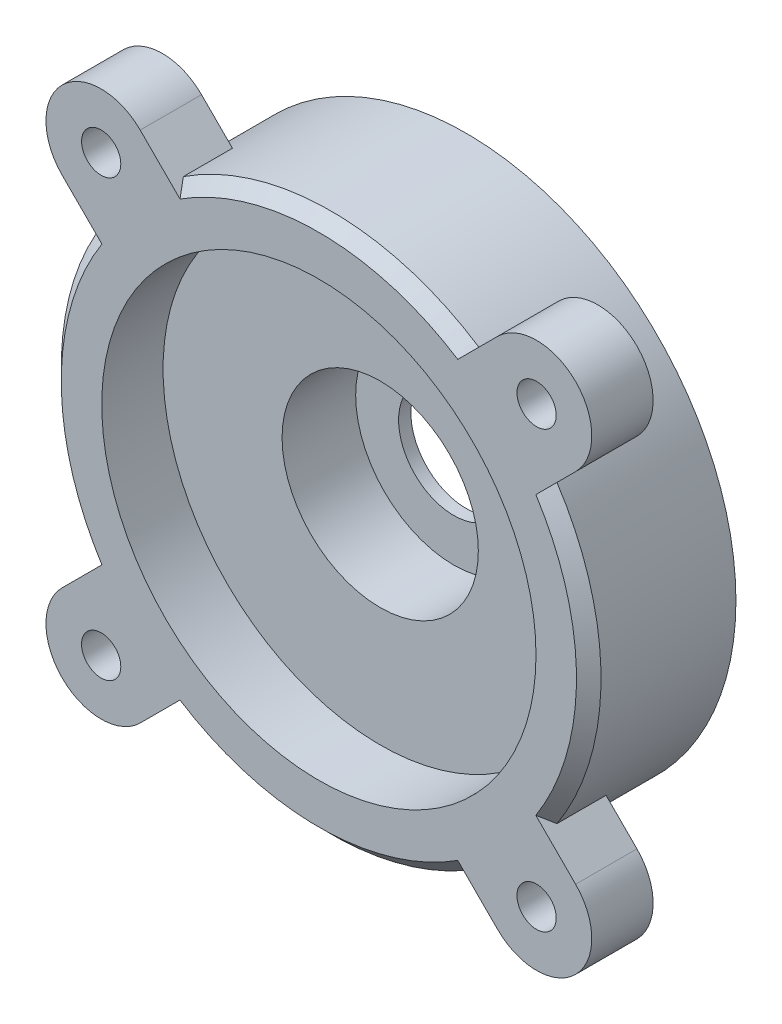
ISO-10303-21;
HEADER;
FILE_DESCRIPTION(('STEP AP214'),'2;1');
FILE_NAME('part.step','',(''),(''),'','','');
FILE_SCHEMA(('AUTOMOTIVE_DESIGN { 1 0 10303 214 1 1 1 1 }'));
ENDSEC;
DATA;
#1=APPLICATION_CONTEXT('core data for automotive mechanical design processes');
#2=APPLICATION_PROTOCOL_DEFINITION('international standard','automotive_design',2000,#1);
#3=PRODUCT_CONTEXT('',#1,'mechanical');
#4=PRODUCT('Part','Part','',(#3));
#5=PRODUCT_RELATED_PRODUCT_CATEGORY('part','',(#4));
#6=PRODUCT_DEFINITION_FORMATION('','',#4);
#7=PRODUCT_DEFINITION_CONTEXT('part definition',#1,'design');
#8=PRODUCT_DEFINITION('design','',#6,#7);
#9=PRODUCT_DEFINITION_SHAPE('','',#8);
#10=(LENGTH_UNIT() NAMED_UNIT(*) SI_UNIT(.MILLI.,.METRE.));
#11=(NAMED_UNIT(*) PLANE_ANGLE_UNIT() SI_UNIT($,.RADIAN.));
#12=(NAMED_UNIT(*) SI_UNIT($,.STERADIAN.) SOLID_ANGLE_UNIT());
#13=UNCERTAINTY_MEASURE_WITH_UNIT(LENGTH_MEASURE(1.E-05),#10,'distance_accuracy_value','');
#14=(GEOMETRIC_REPRESENTATION_CONTEXT(3) GLOBAL_UNCERTAINTY_ASSIGNED_CONTEXT((#13)) GLOBAL_UNIT_ASSIGNED_CONTEXT((#10,
#11,#12)) REPRESENTATION_CONTEXT('',''));
#15=CARTESIAN_POINT('',(0.,0.,0.));
#16=DIRECTION('',(0.,0.,1.));
#17=DIRECTION('',(1.,0.,0.));
#18=AXIS2_PLACEMENT_3D('',#15,#16,#17);
#19=CARTESIAN_POINT('',(0.,0.,6.));
#20=DIRECTION('',(0.,0.,-1.));
#21=DIRECTION('',(-1.,0.,0.));
#22=AXIS2_PLACEMENT_3D('',#19,#20,#21);
#23=CONICAL_SURFACE('',#22,21.,0.785398163397448);
#24=CARTESIAN_POINT('',(-11.3221844044348,17.6861454351131,6.0002));
#25=CARTESIAN_POINT('',(-11.442817573575,17.8067786042533,5.83355757009398));
#26=CARTESIAN_POINT('',(-11.5634193156647,17.9273803463431,5.66686968833641));
#27=CARTESIAN_POINT('',(-11.8045599453449,18.1685209760232,5.33340302166944));
#28=CARTESIAN_POINT('',(-11.9250988329356,18.2890598636139,5.16662423676035));
#29=CARTESIAN_POINT('',(-12.045606293476,18.4095673241543,4.99980000000001));
#30=B_SPLINE_CURVE_WITH_KNOTS('',3,(#24,#25,#26,#27,#28,#29),.UNSPECIFIED.,.F.,.F.,(4,2,4),(0.,
0.715450692106052,1.43090138184666),.UNSPECIFIED.);
#31=CARTESIAN_POINT('',(-11.3223291890217,17.6862902197,6.));
#32=VERTEX_POINT('',#31);
#33=CARTESIAN_POINT('',(-12.045461817502,18.4094228481803,5.00000000000001));
#34=VERTEX_POINT('',#33);
#35=EDGE_CURVE('E714',#32,#34,#30,.T.);
#36=ORIENTED_EDGE('',*,*,#35,.F.);
#37=CARTESIAN_POINT('',(0.,0.,6.));
#38=DIRECTION('',(0.,0.,1.));
#39=DIRECTION('',(1.,0.,0.));
#40=AXIS2_PLACEMENT_3D('',#37,#38,#39);
#41=CIRCLE('',#40,21.);
#42=CARTESIAN_POINT('',(11.322329189021,17.6862902196997,6.));
#43=VERTEX_POINT('',#42);
#44=EDGE_CURVE('E319',#43,#32,#41,.T.);
#45=ORIENTED_EDGE('',*,*,#44,.F.);
#46=CARTESIAN_POINT('',(12.0456062934758,18.4095673241545,4.99980000000001));
#47=CARTESIAN_POINT('',(11.9250988329353,18.289059863614,5.16662423676035));
#48=CARTESIAN_POINT('',(11.8045599453447,18.1685209760234,5.33340302166944));
#49=CARTESIAN_POINT('',(11.5634193156645,17.9273803463432,5.66686968833641));
#50=CARTESIAN_POINT('',(11.4428175735747,17.8067786042534,5.83355757009397));
#51=CARTESIAN_POINT('',(11.3221844044346,17.6861454351133,6.0002));
#52=B_SPLINE_CURVE_WITH_KNOTS('',3,(#46,#47,#48,#49,#50,#51),.UNSPECIFIED.,.F.,.F.,(4,2,4),(0.,
0.715450689740606,1.43090138184666),.UNSPECIFIED.);
#53=CARTESIAN_POINT('',(12.0454618175017,18.4094228481805,5.));
#54=VERTEX_POINT('',#53);
#55=EDGE_CURVE('E327',#54,#43,#52,.T.);
#56=ORIENTED_EDGE('',*,*,#55,.F.);
#57=CARTESIAN_POINT('',(0.,0.,5.00000000000001));
#58=DIRECTION('',(0.,0.,1.));
#59=DIRECTION('',(1.,0.,0.));
#60=AXIS2_PLACEMENT_3D('',#57,#58,#59);
#61=CIRCLE('',#60,22.);
#62=EDGE_CURVE('E322',#34,#54,#61,.F.);
#63=ORIENTED_EDGE('',*,*,#62,.F.);
#64=EDGE_LOOP('',(#36,#45,#56,#63));
#65=FACE_BOUND('',#64,.T.);
#66=ADVANCED_FACE('F34',(#65),#23,.T.);
#67=CARTESIAN_POINT('',(-18.4095673241548,12.0456062934753,4.99980000000001));
#68=CARTESIAN_POINT('',(-18.2890598636144,11.9250988329348,5.16662423676035));
#69=CARTESIAN_POINT('',(-18.1685209760237,11.8045599453442,5.33340302166944));
#70=CARTESIAN_POINT('',(-17.9273803463435,11.563419315664,5.66686968833641));
#71=CARTESIAN_POINT('',(-17.8067786042538,11.4428175735742,5.83355757009398));
#72=CARTESIAN_POINT('',(-17.6861454351136,11.3221844044341,6.0002));
#73=B_SPLINE_CURVE_WITH_KNOTS('',3,(#67,#68,#69,#70,#71,#72),.UNSPECIFIED.,.F.,.F.,(4,2,4),(0.,
0.715450689740612,1.43090138184667),.UNSPECIFIED.);
#74=CARTESIAN_POINT('',(-18.4094228481808,12.0454618175012,5.00000000000001));
#75=VERTEX_POINT('',#74);
#76=CARTESIAN_POINT('',(-17.6862902197006,11.3223291890211,6.));
#77=VERTEX_POINT('',#76);
#78=EDGE_CURVE('E207',#75,#77,#73,.T.);
#79=ORIENTED_EDGE('',*,*,#78,.F.);
#80=CARTESIAN_POINT('',(-18.4094228481807,-12.0454618175013,5.00000000000001));
#81=VERTEX_POINT('',#80);
#82=EDGE_CURVE('E752',#81,#75,#61,.F.);
#83=ORIENTED_EDGE('',*,*,#82,.F.);
#84=CARTESIAN_POINT('',(-17.6861454351135,-11.3221844044342,6.0002));
#85=CARTESIAN_POINT('',(-17.8067786042537,-11.4428175735743,5.83355757009397));
#86=CARTESIAN_POINT('',(-17.9273803463435,-11.5634193156641,5.66686968833641));
#87=CARTESIAN_POINT('',(-18.1685209760237,-11.8045599453443,5.33340302166944));
#88=CARTESIAN_POINT('',(-18.2890598636143,-11.9250988329349,5.16662423676035));
#89=CARTESIAN_POINT('',(-18.4095673241548,-12.0456062934754,4.99980000000001));
#90=B_SPLINE_CURVE_WITH_KNOTS('',3,(#84,#85,#86,#87,#88,#89),.UNSPECIFIED.,.F.,.F.,(4,2,4),(0.,
0.715450692106054,1.43090138184666),.UNSPECIFIED.);
#91=CARTESIAN_POINT('',(-17.6862902197009,-11.3223291890215,6.));
#92=VERTEX_POINT('',#91);
#93=EDGE_CURVE('E242',#92,#81,#90,.T.);
#94=ORIENTED_EDGE('',*,*,#93,.F.);
#95=EDGE_CURVE('E323',#77,#92,#41,.T.);
#96=ORIENTED_EDGE('',*,*,#95,.F.);
#97=EDGE_LOOP('',(#79,#83,#94,#96));
#98=FACE_BOUND('',#97,.T.);
#99=ADVANCED_FACE('F370',(#98),#23,.T.);
#100=CARTESIAN_POINT('',(-12.0456062934759,-18.4095673241544,4.99980000000001));
#101=CARTESIAN_POINT('',(-11.9250988329354,-18.2890598636139,5.16662423676035));
#102=CARTESIAN_POINT('',(-11.8045599453448,-18.1685209760233,5.33340302166944));
#103=CARTESIAN_POINT('',(-11.5634193156646,-17.9273803463431,5.66686968833641));
#104=CARTESIAN_POINT('',(-11.4428175735749,-17.8067786042533,5.83355757009397));
#105=CARTESIAN_POINT('',(-11.3221844044347,-17.6861454351132,6.0002));
#106=B_SPLINE_CURVE_WITH_KNOTS('',3,(#100,#101,#102,#103,#104,#105),.UNSPECIFIED.,.F.,.F.,(4,2,
4),(0.,0.715450689740608,1.43090138184666),.UNSPECIFIED.);
#107=CARTESIAN_POINT('',(-12.0454618175019,-18.4094228481804,5.00000000000001));
#108=VERTEX_POINT('',#107);
#109=CARTESIAN_POINT('',(-11.322329189022,-17.6862902197005,6.));
#110=VERTEX_POINT('',#109);
#111=EDGE_CURVE('E741',#108,#110,#106,.T.);
#112=ORIENTED_EDGE('',*,*,#111,.F.);
#113=CARTESIAN_POINT('',(12.0454618175009,-18.409422848181,5.));
#114=VERTEX_POINT('',#113);
#115=EDGE_CURVE('E328',#114,#108,#61,.F.);
#116=ORIENTED_EDGE('',*,*,#115,.F.);
#117=CARTESIAN_POINT('',(11.3221844044337,-17.6861454351138,6.0002));
#118=CARTESIAN_POINT('',(11.4428175735739,-17.806778604254,5.83355757009398));
#119=CARTESIAN_POINT('',(11.5634193156636,-17.9273803463438,5.66686968833641));
#120=CARTESIAN_POINT('',(11.8045599453438,-18.168520976024,5.33340302166944));
#121=CARTESIAN_POINT('',(11.9250988329345,-18.2890598636146,5.16662423676035));
#122=CARTESIAN_POINT('',(12.0456062934749,-18.409567324155,4.99980000000001));
#123=B_SPLINE_CURVE_WITH_KNOTS('',3,(#117,#118,#119,#120,#121,#122),.UNSPECIFIED.,.F.,.F.,(4,2,
4),(0.,0.715450692106056,1.43090138184667),.UNSPECIFIED.);
#124=CARTESIAN_POINT('',(11.3223291890206,-17.6862902197007,6.));
#125=VERTEX_POINT('',#124);
#126=EDGE_CURVE('E394',#125,#114,#123,.T.);
#127=ORIENTED_EDGE('',*,*,#126,.F.);
#128=EDGE_CURVE('E762',#110,#125,#41,.T.);
#129=ORIENTED_EDGE('',*,*,#128,.F.);
#130=EDGE_LOOP('',(#112,#116,#127,#129));
#131=FACE_BOUND('',#130,.T.);
#132=ADVANCED_FACE('F365',(#131),#23,.T.);
#133=CARTESIAN_POINT('',(0.,0.,6.));
#134=DIRECTION('',(0.,0.,-1.));
#135=DIRECTION('',(-1.,0.,0.));
#136=AXIS2_PLACEMENT_3D('',#133,#134,#135);
#137=CYLINDRICAL_SURFACE('',#136,22.);
#138=CARTESIAN_POINT('',(0.,0.,1.));
#139=DIRECTION('',(0.,0.,-1.));
#140=DIRECTION('',(-1.,0.,0.));
#141=AXIS2_PLACEMENT_3D('',#138,#139,#140);
#142=CIRCLE('',#141,22.);
#143=CARTESIAN_POINT('',(-18.4094228481808,12.0454618175012,1.));
#144=VERTEX_POINT('',#143);
#145=CARTESIAN_POINT('',(-12.045461817502,18.4094228481803,1.));
#146=VERTEX_POINT('',#145);
#147=EDGE_CURVE('E11',#144,#146,#142,.T.);
#148=ORIENTED_EDGE('',*,*,#147,.T.);
#149=DIRECTION('',(0.,0.,-1.));
#150=VECTOR('',#149,1.);
#151=CARTESIAN_POINT('',(-12.045461817502,18.4094228481803,6.));
#152=LINE('',#151,#150);
#153=EDGE_CURVE('E214',#146,#34,#152,.F.);
#154=ORIENTED_EDGE('',*,*,#153,.T.);
#155=ORIENTED_EDGE('',*,*,#62,.T.);
#156=DIRECTION('',(0.,0.,-1.));
#157=VECTOR('',#156,1.);
#158=CARTESIAN_POINT('',(12.0454618175017,18.4094228481805,6.));
#159=LINE('',#158,#157);
#160=CARTESIAN_POINT('',(12.0454618175017,18.4094228481805,1.));
#161=VERTEX_POINT('',#160);
#162=EDGE_CURVE('E308',#54,#161,#159,.T.);
#163=ORIENTED_EDGE('',*,*,#162,.T.);
#164=CARTESIAN_POINT('',(0.,0.,1.));
#165=DIRECTION('',(0.,0.,-1.));
#166=DIRECTION('',(-1.,0.,0.));
#167=AXIS2_PLACEMENT_3D('',#164,#165,#166);
#168=CIRCLE('',#167,22.);
#169=CARTESIAN_POINT('',(18.4094228481806,12.0454618175015,1.));
#170=VERTEX_POINT('',#169);
#171=EDGE_CURVE('E395',#161,#170,#168,.T.);
#172=ORIENTED_EDGE('',*,*,#171,.T.);
#173=DIRECTION('',(0.,0.,-1.));
#174=VECTOR('',#173,1.);
#175=CARTESIAN_POINT('',(18.4094228481806,12.0454618175015,6.));
#176=LINE('',#175,#174);
#177=CARTESIAN_POINT('',(18.4094228481806,12.0454618175015,5.00000000000001));
#178=VERTEX_POINT('',#177);
#179=EDGE_CURVE('E312',#170,#178,#176,.F.);
#180=ORIENTED_EDGE('',*,*,#179,.T.);
#181=CARTESIAN_POINT('',(18.4094228481801,-12.0454618175023,5.));
#182=VERTEX_POINT('',#181);
#183=EDGE_CURVE('E324',#178,#182,#61,.F.);
#184=ORIENTED_EDGE('',*,*,#183,.T.);
#185=DIRECTION('',(0.,0.,-1.));
#186=VECTOR('',#185,1.);
#187=CARTESIAN_POINT('',(18.4094228481801,-12.0454618175023,6.));
#188=LINE('',#187,#186);
#189=CARTESIAN_POINT('',(18.4094228481801,-12.0454618175023,1.));
#190=VERTEX_POINT('',#189);
#191=EDGE_CURVE('E276',#182,#190,#188,.T.);
#192=ORIENTED_EDGE('',*,*,#191,.T.);
#193=CARTESIAN_POINT('',(0.,0.,1.));
#194=DIRECTION('',(0.,0.,-1.));
#195=DIRECTION('',(-1.,0.,0.));
#196=AXIS2_PLACEMENT_3D('',#193,#194,#195);
#197=CIRCLE('',#196,22.);
#198=CARTESIAN_POINT('',(12.0454618175009,-18.409422848181,1.));
#199=VERTEX_POINT('',#198);
#200=EDGE_CURVE('E770',#190,#199,#197,.T.);
#201=ORIENTED_EDGE('',*,*,#200,.T.);
#202=DIRECTION('',(0.,0.,-1.));
#203=VECTOR('',#202,1.);
#204=CARTESIAN_POINT('',(12.0454618175009,-18.409422848181,6.));
#205=LINE('',#204,#203);
#206=EDGE_CURVE('E280',#199,#114,#205,.F.);
#207=ORIENTED_EDGE('',*,*,#206,.T.);
#208=ORIENTED_EDGE('',*,*,#115,.T.);
#209=DIRECTION('',(0.,0.,-1.));
#210=VECTOR('',#209,1.);
#211=CARTESIAN_POINT('',(-12.0454618175019,-18.4094228481804,6.));
#212=LINE('',#211,#210);
#213=CARTESIAN_POINT('',(-12.0454618175019,-18.4094228481804,1.));
#214=VERTEX_POINT('',#213);
#215=EDGE_CURVE('E738',#108,#214,#212,.T.);
#216=ORIENTED_EDGE('',*,*,#215,.T.);
#217=CARTESIAN_POINT('',(0.,0.,1.));
#218=DIRECTION('',(0.,0.,-1.));
#219=DIRECTION('',(-1.,0.,0.));
#220=AXIS2_PLACEMENT_3D('',#217,#218,#219);
#221=CIRCLE('',#220,22.);
#222=CARTESIAN_POINT('',(-18.4094228481807,-12.0454618175013,1.));
#223=VERTEX_POINT('',#222);
#224=EDGE_CURVE('E43',#214,#223,#221,.T.);
#225=ORIENTED_EDGE('',*,*,#224,.T.);
#226=DIRECTION('',(0.,0.,-1.));
#227=VECTOR('',#226,1.);
#228=CARTESIAN_POINT('',(-18.4094228481807,-12.0454618175013,6.));
#229=LINE('',#228,#227);
#230=EDGE_CURVE('E250',#223,#81,#229,.F.);
#231=ORIENTED_EDGE('',*,*,#230,.T.);
#232=ORIENTED_EDGE('',*,*,#82,.T.);
#233=DIRECTION('',(0.,0.,-1.));
#234=VECTOR('',#233,1.);
#235=CARTESIAN_POINT('',(-18.4094228481808,12.0454618175012,6.));
#236=LINE('',#235,#234);
#237=EDGE_CURVE('E204',#75,#144,#236,.T.);
#238=ORIENTED_EDGE('',*,*,#237,.T.);
#239=EDGE_LOOP('',(#148,#154,#155,#163,#172,#180,#184,#192,#201,#207,#208,#216,#225,#231,#232,#238));
#240=FACE_BOUND('',#239,.T.);
#241=CARTESIAN_POINT('',(0.,0.,-6.));
#242=DIRECTION('',(0.,0.,1.));
#243=DIRECTION('',(1.,0.,0.));
#244=AXIS2_PLACEMENT_3D('',#241,#242,#243);
#245=CIRCLE('',#244,22.);
#246=CARTESIAN_POINT('',(22.,0.,-6.));
#247=VERTEX_POINT('',#246);
#248=EDGE_CURVE('E315',#247,#247,#245,.T.);
#249=ORIENTED_EDGE('',*,*,#248,.T.);
#250=EDGE_LOOP('',(#249));
#251=FACE_BOUND('',#250,.T.);
#252=ADVANCED_FACE('F360',(#240,#251),#137,.T.);
#253=CARTESIAN_POINT('',(0.,0.,6.));
#254=DIRECTION('',(0.,0.,1.));
#255=DIRECTION('',(1.,0.,0.));
#256=AXIS2_PLACEMENT_3D('',#253,#254,#255);
#257=PLANE('',#256);
#258=CARTESIAN_POINT('',(0.,0.,6.));
#259=DIRECTION('',(0.,0.,1.));
#260=DIRECTION('',(1.,0.,0.));
#261=AXIS2_PLACEMENT_3D('',#258,#259,#260);
#262=CIRCLE('',#261,17.7);
#263=CARTESIAN_POINT('',(17.7,0.,6.));
#264=VERTEX_POINT('',#263);
#265=EDGE_CURVE('E688',#264,#264,#262,.T.);
#266=ORIENTED_EDGE('',*,*,#265,.F.);
#267=EDGE_LOOP('',(#266));
#268=FACE_BOUND('',#267,.T.);
#269=ORIENTED_EDGE('',*,*,#44,.T.);
#270=DIRECTION('',(-0.707106781186546,0.707106781186549,0.));
#271=VECTOR('',#270,1.);
#272=CARTESIAN_POINT('',(-14.566399692443,20.9303607231214,6.));
#273=LINE('',#272,#271);
#274=CARTESIAN_POINT('',(-14.566399692443,20.9303607231214,6.));
#275=VERTEX_POINT('',#274);
#276=EDGE_CURVE('E191',#32,#275,#273,.T.);
#277=ORIENTED_EDGE('',*,*,#276,.T.);
#278=CARTESIAN_POINT('',(-17.7483802077825,17.7483802077819,6.));
#279=DIRECTION('',(0.,0.,1.));
#280=DIRECTION('',(-1.,0.,0.));
#281=AXIS2_PLACEMENT_3D('',#278,#279,#280);
#282=CIRCLE('',#281,4.50000000000001);
#283=CARTESIAN_POINT('',(-20.930360723122,14.5663996924424,6.));
#284=VERTEX_POINT('',#283);
#285=EDGE_CURVE('E200',#275,#284,#282,.T.);
#286=ORIENTED_EDGE('',*,*,#285,.T.);
#287=DIRECTION('',(0.707106781186548,-0.707106781186547,0.));
#288=VECTOR('',#287,1.);
#289=CARTESIAN_POINT('',(-20.930360723122,14.5663996924424,6.));
#290=LINE('',#289,#288);
#291=EDGE_CURVE('E178',#284,#77,#290,.T.);
#292=ORIENTED_EDGE('',*,*,#291,.T.);
#293=ORIENTED_EDGE('',*,*,#95,.T.);
#294=DIRECTION('',(-0.70710678118655,-0.707106781186544,0.));
#295=VECTOR('',#294,1.);
#296=CARTESIAN_POINT('',(-20.9303607231223,-14.5663996924429,6.));
#297=LINE('',#296,#295);
#298=CARTESIAN_POINT('',(-20.9303607231223,-14.5663996924429,6.));
#299=VERTEX_POINT('',#298);
#300=EDGE_CURVE('E724',#92,#299,#297,.T.);
#301=ORIENTED_EDGE('',*,*,#300,.T.);
#302=CARTESIAN_POINT('',(-17.7483802077828,-17.7483802077824,6.));
#303=DIRECTION('',(0.,0.,1.));
#304=DIRECTION('',(-1.,0.,0.));
#305=AXIS2_PLACEMENT_3D('',#302,#303,#304);
#306=CIRCLE('',#305,4.50000000000001);
#307=CARTESIAN_POINT('',(-14.5663996924433,-20.9303607231218,6.));
#308=VERTEX_POINT('',#307);
#309=EDGE_CURVE('E717',#299,#308,#306,.T.);
#310=ORIENTED_EDGE('',*,*,#309,.T.);
#311=DIRECTION('',(0.707106781186548,0.707106781186547,0.));
#312=VECTOR('',#311,1.);
#313=CARTESIAN_POINT('',(-14.5663996924433,-20.9303607231218,6.));
#314=LINE('',#313,#312);
#315=EDGE_CURVE('E731',#308,#110,#314,.T.);
#316=ORIENTED_EDGE('',*,*,#315,.T.);
#317=ORIENTED_EDGE('',*,*,#128,.T.);
#318=DIRECTION('',(0.707106781186546,-0.707106781186549,0.));
#319=VECTOR('',#318,1.);
#320=CARTESIAN_POINT('',(14.566399692442,-20.9303607231221,6.));
#321=LINE('',#320,#319);
#322=CARTESIAN_POINT('',(14.566399692442,-20.9303607231221,6.));
#323=VERTEX_POINT('',#322);
#324=EDGE_CURVE('E262',#125,#323,#321,.T.);
#325=ORIENTED_EDGE('',*,*,#324,.T.);
#326=CARTESIAN_POINT('',(17.7483802077815,-17.7483802077827,6.));
#327=DIRECTION('',(0.,0.,1.));
#328=DIRECTION('',(-1.,0.,0.));
#329=AXIS2_PLACEMENT_3D('',#326,#327,#328);
#330=CIRCLE('',#329,4.50000000000001);
#331=CARTESIAN_POINT('',(20.9303607231209,-14.5663996924432,6.));
#332=VERTEX_POINT('',#331);
#333=EDGE_CURVE('E255',#323,#332,#330,.T.);
#334=ORIENTED_EDGE('',*,*,#333,.T.);
#335=DIRECTION('',(-0.707106781186549,0.707106781186546,0.));
#336=VECTOR('',#335,1.);
#337=CARTESIAN_POINT('',(20.9303607231209,-14.5663996924432,6.));
#338=LINE('',#337,#336);
#339=CARTESIAN_POINT('',(17.6862902196984,-11.322329189023,6.));
#340=VERTEX_POINT('',#339);
#341=EDGE_CURVE('E270',#332,#340,#338,.T.);
#342=ORIENTED_EDGE('',*,*,#341,.T.);
#343=CARTESIAN_POINT('',(17.6862902196998,11.3223291890207,6.));
#344=VERTEX_POINT('',#343);
#345=EDGE_CURVE('E318',#340,#344,#41,.T.);
#346=ORIENTED_EDGE('',*,*,#345,.T.);
#347=DIRECTION('',(0.707106781186541,0.707106781186554,0.));
#348=VECTOR('',#347,1.);
#349=CARTESIAN_POINT('',(20.9303607231212,14.5663996924421,6.));
#350=LINE('',#349,#348);
#351=CARTESIAN_POINT('',(20.9303607231212,14.5663996924421,6.));
#352=VERTEX_POINT('',#351);
#353=EDGE_CURVE('E294',#344,#352,#350,.T.);
#354=ORIENTED_EDGE('',*,*,#353,.T.);
#355=CARTESIAN_POINT('',(17.7483802077821,17.7483802077819,6.));
#356=DIRECTION('',(0.,0.,1.));
#357=DIRECTION('',(-1.,0.,0.));
#358=AXIS2_PLACEMENT_3D('',#355,#356,#357);
#359=CIRCLE('',#358,4.50000000000001);
#360=CARTESIAN_POINT('',(14.5663996924423,20.9303607231211,6.));
#361=VERTEX_POINT('',#360);
#362=EDGE_CURVE('E287',#352,#361,#359,.T.);
#363=ORIENTED_EDGE('',*,*,#362,.T.);
#364=DIRECTION('',(-0.707106781186538,-0.707106781186557,0.));
#365=VECTOR('',#364,1.);
#366=CARTESIAN_POINT('',(14.5663996924423,20.9303607231211,6.));
#367=LINE('',#366,#365);
#368=EDGE_CURVE('E302',#361,#43,#367,.T.);
#369=ORIENTED_EDGE('',*,*,#368,.T.);
#370=EDGE_LOOP('',(#269,#277,#286,#292,#293,#301,#310,#316,#317,#325,#334,#342,#346,#354,#363,#369));
#371=FACE_BOUND('',#370,.T.);
#372=CARTESIAN_POINT('',(17.7483802077821,17.7483802077819,6.));
#373=DIRECTION('',(0.,0.,1.));
#374=DIRECTION('',(1.,0.,0.));
#375=AXIS2_PLACEMENT_3D('',#372,#373,#374);
#376=CIRCLE('',#375,1.60000000000031);
#377=CARTESIAN_POINT('',(19.3483802077824,17.7483802077819,6.));
#378=VERTEX_POINT('',#377);
#379=EDGE_CURVE('E283',#378,#378,#376,.T.);
#380=ORIENTED_EDGE('',*,*,#379,.F.);
#381=EDGE_LOOP('',(#380));
#382=FACE_BOUND('',#381,.T.);
#383=CARTESIAN_POINT('',(17.7483802077815,-17.7483802077827,6.));
#384=DIRECTION('',(0.,0.,1.));
#385=DIRECTION('',(1.,0.,0.));
#386=AXIS2_PLACEMENT_3D('',#383,#384,#385);
#387=CIRCLE('',#386,1.59999999999998);
#388=CARTESIAN_POINT('',(19.3483802077814,-17.7483802077827,6.));
#389=VERTEX_POINT('',#388);
#390=EDGE_CURVE('E249',#389,#389,#387,.T.);
#391=ORIENTED_EDGE('',*,*,#390,.F.);
#392=EDGE_LOOP('',(#391));
#393=FACE_BOUND('',#392,.T.);
#394=CARTESIAN_POINT('',(-17.7483802077828,-17.7483802077824,6.));
#395=DIRECTION('',(0.,0.,1.));
#396=DIRECTION('',(1.,0.,0.));
#397=AXIS2_PLACEMENT_3D('',#394,#395,#396);
#398=CIRCLE('',#397,1.5999999999996);
#399=CARTESIAN_POINT('',(-16.1483802077832,-17.7483802077824,6.));
#400=VERTEX_POINT('',#399);
#401=EDGE_CURVE('E711',#400,#400,#398,.T.);
#402=ORIENTED_EDGE('',*,*,#401,.F.);
#403=EDGE_LOOP('',(#402));
#404=FACE_BOUND('',#403,.T.);
#405=CARTESIAN_POINT('',(-17.7483802077825,17.7483802077819,6.));
#406=DIRECTION('',(0.,0.,1.));
#407=DIRECTION('',(1.,0.,0.));
#408=AXIS2_PLACEMENT_3D('',#405,#406,#407);
#409=CIRCLE('',#408,1.60000000000046);
#410=CARTESIAN_POINT('',(-16.1483802077821,17.7483802077819,6.));
#411=VERTEX_POINT('',#410);
#412=EDGE_CURVE('E196',#411,#411,#409,.T.);
#413=ORIENTED_EDGE('',*,*,#412,.F.);
#414=EDGE_LOOP('',(#413));
#415=FACE_BOUND('',#414,.T.);
#416=ADVANCED_FACE('F356',(#268,#371,#382,#393,#404,#415),#257,.T.);
#417=CARTESIAN_POINT('',(0.,0.,-6.));
#418=DIRECTION('',(0.,0.,1.));
#419=DIRECTION('',(1.,0.,0.));
#420=AXIS2_PLACEMENT_3D('',#417,#418,#419);
#421=PLANE('',#420);
#422=CARTESIAN_POINT('',(0.,0.,-6.));
#423=DIRECTION('',(0.,0.,1.));
#424=DIRECTION('',(1.,0.,0.));
#425=AXIS2_PLACEMENT_3D('',#422,#423,#424);
#426=CIRCLE('',#425,4.5);
#427=CARTESIAN_POINT('',(4.5,0.,-6.));
#428=VERTEX_POINT('',#427);
#429=EDGE_CURVE('E677',#428,#428,#426,.T.);
#430=ORIENTED_EDGE('',*,*,#429,.T.);
#431=EDGE_LOOP('',(#430));
#432=FACE_BOUND('',#431,.T.);
#433=ORIENTED_EDGE('',*,*,#248,.F.);
#434=EDGE_LOOP('',(#433));
#435=FACE_BOUND('',#434,.T.);
#436=ADVANCED_FACE('F359',(#432,#435),#421,.F.);
#437=CARTESIAN_POINT('',(18.4095673241541,-12.0456062934764,4.99980000000001));
#438=CARTESIAN_POINT('',(18.2890598636136,-11.9250988329359,5.16662423676035));
#439=CARTESIAN_POINT('',(18.168520976023,-11.8045599453453,5.33340302166944));
#440=CARTESIAN_POINT('',(17.9273803463428,-11.5634193156651,5.66686968833641));
#441=CARTESIAN_POINT('',(17.8067786042531,-11.4428175735753,5.83355757009397));
#442=CARTESIAN_POINT('',(17.6861454351129,-11.3221844044352,6.0002));
#443=B_SPLINE_CURVE_WITH_KNOTS('',3,(#437,#438,#439,#440,#441,#442),.UNSPECIFIED.,.F.,.F.,(4,2,
4),(0.,0.715450689740607,1.43090138184666),.UNSPECIFIED.);
#444=EDGE_CURVE('E390',#182,#340,#443,.T.);
#445=ORIENTED_EDGE('',*,*,#444,.F.);
#446=ORIENTED_EDGE('',*,*,#183,.F.);
#447=CARTESIAN_POINT('',(17.6861454351135,11.3221844044343,6.0002));
#448=CARTESIAN_POINT('',(17.8067786042536,11.4428175735745,5.83355757009398));
#449=CARTESIAN_POINT('',(17.9273803463434,11.5634193156642,5.66686968833641));
#450=CARTESIAN_POINT('',(18.1685209760236,11.8045599453444,5.33340302166944));
#451=CARTESIAN_POINT('',(18.2890598636142,11.9250988329351,5.16662423676034));
#452=CARTESIAN_POINT('',(18.4095673241547,12.0456062934755,4.9998));
#453=B_SPLINE_CURVE_WITH_KNOTS('',3,(#447,#448,#449,#450,#451,#452),.UNSPECIFIED.,.F.,.F.,(4,2,
4),(0.,0.715450692106058,1.43090138184667),.UNSPECIFIED.);
#454=EDGE_CURVE('E336',#344,#178,#453,.T.);
#455=ORIENTED_EDGE('',*,*,#454,.F.);
#456=ORIENTED_EDGE('',*,*,#345,.F.);
#457=EDGE_LOOP('',(#445,#446,#455,#456));
#458=FACE_BOUND('',#457,.T.);
#459=ADVANCED_FACE('F36',(#458),#23,.T.);
#460=CARTESIAN_POINT('',(20.9303607231212,14.5663996924421,1.));
#461=DIRECTION('',(0.707106781186554,-0.707106781186541,0.));
#462=DIRECTION('',(0.707106781186541,0.707106781186554,0.));
#463=AXIS2_PLACEMENT_3D('',#460,#461,#462);
#464=PLANE('',#463);
#465=ORIENTED_EDGE('',*,*,#179,.F.);
#466=DIRECTION('',(0.707106781186541,0.707106781186554,0.));
#467=VECTOR('',#466,1.);
#468=CARTESIAN_POINT('',(20.9303607231212,14.5663996924421,1.));
#469=LINE('',#468,#467);
#470=CARTESIAN_POINT('',(20.9303607231212,14.5663996924421,1.));
#471=VERTEX_POINT('',#470);
#472=EDGE_CURVE('E297',#170,#471,#469,.T.);
#473=ORIENTED_EDGE('',*,*,#472,.T.);
#474=DIRECTION('',(0.,0.,1.));
#475=VECTOR('',#474,1.);
#476=CARTESIAN_POINT('',(20.9303607231212,14.5663996924421,1.));
#477=LINE('',#476,#475);
#478=EDGE_CURVE('E306',#471,#352,#477,.T.);
#479=ORIENTED_EDGE('',*,*,#478,.T.);
#480=ORIENTED_EDGE('',*,*,#353,.F.);
#481=ORIENTED_EDGE('',*,*,#454,.T.);
#482=EDGE_LOOP('',(#465,#473,#479,#480,#481));
#483=FACE_BOUND('',#482,.T.);
#484=ADVANCED_FACE('F348',(#483),#464,.T.);
#485=CARTESIAN_POINT('',(14.5663996924423,20.9303607231211,1.));
#486=DIRECTION('',(-0.707106781186557,0.707106781186538,0.));
#487=DIRECTION('',(-0.707106781186538,-0.707106781186557,0.));
#488=AXIS2_PLACEMENT_3D('',#485,#486,#487);
#489=PLANE('',#488);
#490=ORIENTED_EDGE('',*,*,#162,.F.);
#491=ORIENTED_EDGE('',*,*,#55,.T.);
#492=ORIENTED_EDGE('',*,*,#368,.F.);
#493=DIRECTION('',(0.,0.,1.));
#494=VECTOR('',#493,1.);
#495=CARTESIAN_POINT('',(14.5663996924423,20.9303607231211,1.));
#496=LINE('',#495,#494);
#497=CARTESIAN_POINT('',(14.5663996924423,20.9303607231211,1.));
#498=VERTEX_POINT('',#497);
#499=EDGE_CURVE('E299',#498,#361,#496,.T.);
#500=ORIENTED_EDGE('',*,*,#499,.F.);
#501=DIRECTION('',(-0.707106781186538,-0.707106781186557,0.));
#502=VECTOR('',#501,1.);
#503=CARTESIAN_POINT('',(14.5663996924423,20.9303607231211,1.));
#504=LINE('',#503,#502);
#505=EDGE_CURVE('E293',#498,#161,#504,.T.);
#506=ORIENTED_EDGE('',*,*,#505,.T.);
#507=EDGE_LOOP('',(#490,#491,#492,#500,#506));
#508=FACE_BOUND('',#507,.T.);
#509=ADVANCED_FACE('F343',(#508),#489,.T.);
#510=CARTESIAN_POINT('',(17.7483802077821,17.7483802077819,1.));
#511=DIRECTION('',(0.,0.,1.));
#512=DIRECTION('',(1.,0.,0.));
#513=AXIS2_PLACEMENT_3D('',#510,#511,#512);
#514=CYLINDRICAL_SURFACE('',#513,4.50000000000001);
#515=ORIENTED_EDGE('',*,*,#362,.F.);
#516=ORIENTED_EDGE('',*,*,#478,.F.);
#517=CARTESIAN_POINT('',(17.7483802077821,17.7483802077819,1.));
#518=DIRECTION('',(0.,0.,1.));
#519=DIRECTION('',(-1.,0.,0.));
#520=AXIS2_PLACEMENT_3D('',#517,#518,#519);
#521=CIRCLE('',#520,4.50000000000001);
#522=EDGE_CURVE('E290',#471,#498,#521,.T.);
#523=ORIENTED_EDGE('',*,*,#522,.T.);
#524=ORIENTED_EDGE('',*,*,#499,.T.);
#525=EDGE_LOOP('',(#515,#516,#523,#524));
#526=FACE_BOUND('',#525,.T.);
#527=ADVANCED_FACE('F347',(#526),#514,.T.);
#528=CARTESIAN_POINT('',(17.7483802077821,17.7483802077819,1.));
#529=DIRECTION('',(0.,0.,-1.));
#530=DIRECTION('',(-1.,0.,0.));
#531=AXIS2_PLACEMENT_3D('',#528,#529,#530);
#532=PLANE('',#531);
#533=ORIENTED_EDGE('',*,*,#171,.F.);
#534=ORIENTED_EDGE('',*,*,#505,.F.);
#535=ORIENTED_EDGE('',*,*,#522,.F.);
#536=ORIENTED_EDGE('',*,*,#472,.F.);
#537=EDGE_LOOP('',(#533,#534,#535,#536));
#538=FACE_BOUND('',#537,.T.);
#539=CARTESIAN_POINT('',(17.7483802077821,17.7483802077819,1.));
#540=DIRECTION('',(0.,0.,1.));
#541=DIRECTION('',(1.,0.,0.));
#542=AXIS2_PLACEMENT_3D('',#539,#540,#541);
#543=CIRCLE('',#542,1.60000000000031);
#544=CARTESIAN_POINT('',(19.3483802077824,17.7483802077819,1.));
#545=VERTEX_POINT('',#544);
#546=EDGE_CURVE('E284',#545,#545,#543,.T.);
#547=ORIENTED_EDGE('',*,*,#546,.T.);
#548=EDGE_LOOP('',(#547));
#549=FACE_BOUND('',#548,.T.);
#550=ADVANCED_FACE('F354',(#538,#549),#532,.T.);
#551=CARTESIAN_POINT('',(17.7483802077821,17.7483802077819,1.));
#552=DIRECTION('',(0.,0.,1.));
#553=DIRECTION('',(1.,0.,0.));
#554=AXIS2_PLACEMENT_3D('',#551,#552,#553);
#555=CYLINDRICAL_SURFACE('',#554,1.60000000000031);
#556=ORIENTED_EDGE('',*,*,#546,.F.);
#557=EDGE_LOOP('',(#556));
#558=FACE_BOUND('',#557,.T.);
#559=ORIENTED_EDGE('',*,*,#379,.T.);
#560=EDGE_LOOP('',(#559));
#561=FACE_BOUND('',#560,.T.);
#562=ADVANCED_FACE('F433',(#558,#561),#555,.F.);
#563=CARTESIAN_POINT('',(14.566399692442,-20.9303607231221,1.));
#564=DIRECTION('',(-0.707106781186549,-0.707106781186546,0.));
#565=DIRECTION('',(0.707106781186546,-0.707106781186549,0.));
#566=AXIS2_PLACEMENT_3D('',#563,#564,#565);
#567=PLANE('',#566);
#568=ORIENTED_EDGE('',*,*,#206,.F.);
#569=DIRECTION('',(0.707106781186546,-0.707106781186549,0.));
#570=VECTOR('',#569,1.);
#571=CARTESIAN_POINT('',(14.566399692442,-20.9303607231221,1.));
#572=LINE('',#571,#570);
#573=CARTESIAN_POINT('',(14.566399692442,-20.9303607231221,1.));
#574=VERTEX_POINT('',#573);
#575=EDGE_CURVE('E265',#199,#574,#572,.T.);
#576=ORIENTED_EDGE('',*,*,#575,.T.);
#577=DIRECTION('',(0.,0.,1.));
#578=VECTOR('',#577,1.);
#579=CARTESIAN_POINT('',(14.566399692442,-20.9303607231221,1.));
#580=LINE('',#579,#578);
#581=EDGE_CURVE('E274',#574,#323,#580,.T.);
#582=ORIENTED_EDGE('',*,*,#581,.T.);
#583=ORIENTED_EDGE('',*,*,#324,.F.);
#584=ORIENTED_EDGE('',*,*,#126,.T.);
#585=EDGE_LOOP('',(#568,#576,#582,#583,#584));
#586=FACE_BOUND('',#585,.T.);
#587=ADVANCED_FACE('F426',(#586),#567,.T.);
#588=CARTESIAN_POINT('',(20.9303607231209,-14.5663996924432,1.));
#589=DIRECTION('',(0.707106781186546,0.707106781186549,0.));
#590=DIRECTION('',(-0.707106781186549,0.707106781186546,0.));
#591=AXIS2_PLACEMENT_3D('',#588,#589,#590);
#592=PLANE('',#591);
#593=ORIENTED_EDGE('',*,*,#191,.F.);
#594=ORIENTED_EDGE('',*,*,#444,.T.);
#595=ORIENTED_EDGE('',*,*,#341,.F.);
#596=DIRECTION('',(0.,0.,1.));
#597=VECTOR('',#596,1.);
#598=CARTESIAN_POINT('',(20.9303607231209,-14.5663996924432,1.));
#599=LINE('',#598,#597);
#600=CARTESIAN_POINT('',(20.9303607231209,-14.5663996924432,1.));
#601=VERTEX_POINT('',#600);
#602=EDGE_CURVE('E267',#601,#332,#599,.T.);
#603=ORIENTED_EDGE('',*,*,#602,.F.);
#604=DIRECTION('',(-0.707106781186549,0.707106781186546,0.));
#605=VECTOR('',#604,1.);
#606=CARTESIAN_POINT('',(20.9303607231209,-14.5663996924432,1.));
#607=LINE('',#606,#605);
#608=EDGE_CURVE('E261',#601,#190,#607,.T.);
#609=ORIENTED_EDGE('',*,*,#608,.T.);
#610=EDGE_LOOP('',(#593,#594,#595,#603,#609));
#611=FACE_BOUND('',#610,.T.);
#612=ADVANCED_FACE('F421',(#611),#592,.T.);
#613=CARTESIAN_POINT('',(17.7483802077815,-17.7483802077827,1.));
#614=DIRECTION('',(0.,0.,1.));
#615=DIRECTION('',(1.,0.,0.));
#616=AXIS2_PLACEMENT_3D('',#613,#614,#615);
#617=CYLINDRICAL_SURFACE('',#616,4.50000000000001);
#618=ORIENTED_EDGE('',*,*,#333,.F.);
#619=ORIENTED_EDGE('',*,*,#581,.F.);
#620=CARTESIAN_POINT('',(17.7483802077815,-17.7483802077827,1.));
#621=DIRECTION('',(0.,0.,1.));
#622=DIRECTION('',(-1.,0.,0.));
#623=AXIS2_PLACEMENT_3D('',#620,#621,#622);
#624=CIRCLE('',#623,4.50000000000001);
#625=EDGE_CURVE('E258',#574,#601,#624,.T.);
#626=ORIENTED_EDGE('',*,*,#625,.T.);
#627=ORIENTED_EDGE('',*,*,#602,.T.);
#628=EDGE_LOOP('',(#618,#619,#626,#627));
#629=FACE_BOUND('',#628,.T.);
#630=ADVANCED_FACE('F425',(#629),#617,.T.);
#631=CARTESIAN_POINT('',(17.7483802077815,-17.7483802077827,1.));
#632=DIRECTION('',(0.,0.,-1.));
#633=DIRECTION('',(-1.,0.,0.));
#634=AXIS2_PLACEMENT_3D('',#631,#632,#633);
#635=PLANE('',#634);
#636=ORIENTED_EDGE('',*,*,#200,.F.);
#637=ORIENTED_EDGE('',*,*,#608,.F.);
#638=ORIENTED_EDGE('',*,*,#625,.F.);
#639=ORIENTED_EDGE('',*,*,#575,.F.);
#640=EDGE_LOOP('',(#636,#637,#638,#639));
#641=FACE_BOUND('',#640,.T.);
#642=CARTESIAN_POINT('',(17.7483802077815,-17.7483802077827,1.));
#643=DIRECTION('',(0.,0.,1.));
#644=DIRECTION('',(1.,0.,0.));
#645=AXIS2_PLACEMENT_3D('',#642,#643,#644);
#646=CIRCLE('',#645,1.59999999999998);
#647=CARTESIAN_POINT('',(19.3483802077814,-17.7483802077827,1.));
#648=VERTEX_POINT('',#647);
#649=EDGE_CURVE('E252',#648,#648,#646,.T.);
#650=ORIENTED_EDGE('',*,*,#649,.T.);
#651=EDGE_LOOP('',(#650));
#652=FACE_BOUND('',#651,.T.);
#653=ADVANCED_FACE('F431',(#641,#652),#635,.T.);
#654=CARTESIAN_POINT('',(17.7483802077815,-17.7483802077827,1.));
#655=DIRECTION('',(0.,0.,1.));
#656=DIRECTION('',(1.,0.,0.));
#657=AXIS2_PLACEMENT_3D('',#654,#655,#656);
#658=CYLINDRICAL_SURFACE('',#657,1.59999999999998);
#659=ORIENTED_EDGE('',*,*,#649,.F.);
#660=EDGE_LOOP('',(#659));
#661=FACE_BOUND('',#660,.T.);
#662=ORIENTED_EDGE('',*,*,#390,.T.);
#663=EDGE_LOOP('',(#662));
#664=FACE_BOUND('',#663,.T.);
#665=ADVANCED_FACE('F465',(#661,#664),#658,.F.);
#666=CARTESIAN_POINT('',(-17.7483802077828,-17.7483802077824,1.));
#667=DIRECTION('',(0.,0.,1.));
#668=DIRECTION('',(1.,0.,0.));
#669=AXIS2_PLACEMENT_3D('',#666,#667,#668);
#670=CYLINDRICAL_SURFACE('',#669,4.50000000000001);
#671=ORIENTED_EDGE('',*,*,#309,.F.);
#672=DIRECTION('',(0.,0.,1.));
#673=VECTOR('',#672,1.);
#674=CARTESIAN_POINT('',(-20.9303607231223,-14.5663996924429,1.));
#675=LINE('',#674,#673);
#676=CARTESIAN_POINT('',(-20.9303607231223,-14.5663996924429,1.));
#677=VERTEX_POINT('',#676);
#678=EDGE_CURVE('E736',#677,#299,#675,.T.);
#679=ORIENTED_EDGE('',*,*,#678,.F.);
#680=CARTESIAN_POINT('',(-17.7483802077828,-17.7483802077824,1.));
#681=DIRECTION('',(0.,0.,1.));
#682=DIRECTION('',(-1.,0.,0.));
#683=AXIS2_PLACEMENT_3D('',#680,#681,#682);
#684=CIRCLE('',#683,4.50000000000001);
#685=CARTESIAN_POINT('',(-14.5663996924433,-20.9303607231218,1.));
#686=VERTEX_POINT('',#685);
#687=EDGE_CURVE('E720',#677,#686,#684,.T.);
#688=ORIENTED_EDGE('',*,*,#687,.T.);
#689=DIRECTION('',(0.,0.,1.));
#690=VECTOR('',#689,1.);
#691=CARTESIAN_POINT('',(-14.5663996924433,-20.9303607231218,1.));
#692=LINE('',#691,#690);
#693=EDGE_CURVE('E728',#686,#308,#692,.T.);
#694=ORIENTED_EDGE('',*,*,#693,.T.);
#695=EDGE_LOOP('',(#671,#679,#688,#694));
#696=FACE_BOUND('',#695,.T.);
#697=ADVANCED_FACE('F237',(#696),#670,.T.);
#698=CARTESIAN_POINT('',(-20.9303607231223,-14.5663996924429,1.));
#699=DIRECTION('',(-0.707106781186544,0.70710678118655,0.));
#700=DIRECTION('',(-0.707106781186551,-0.707106781186545,0.));
#701=AXIS2_PLACEMENT_3D('',#698,#699,#700);
#702=PLANE('',#701);
#703=ORIENTED_EDGE('',*,*,#300,.F.);
#704=ORIENTED_EDGE('',*,*,#93,.T.);
#705=ORIENTED_EDGE('',*,*,#230,.F.);
#706=DIRECTION('',(-0.70710678118655,-0.707106781186544,0.));
#707=VECTOR('',#706,1.);
#708=CARTESIAN_POINT('',(-20.9303607231223,-14.5663996924429,1.));
#709=LINE('',#708,#707);
#710=EDGE_CURVE('E58',#223,#677,#709,.T.);
#711=ORIENTED_EDGE('',*,*,#710,.T.);
#712=ORIENTED_EDGE('',*,*,#678,.T.);
#713=EDGE_LOOP('',(#703,#704,#705,#711,#712));
#714=FACE_BOUND('',#713,.T.);
#715=ADVANCED_FACE('F233',(#714),#702,.T.);
#716=CARTESIAN_POINT('',(-14.5663996924433,-20.9303607231218,1.));
#717=DIRECTION('',(0.707106781186547,-0.707106781186548,0.));
#718=DIRECTION('',(0.707106781186548,0.707106781186547,0.));
#719=AXIS2_PLACEMENT_3D('',#716,#717,#718);
#720=PLANE('',#719);
#721=ORIENTED_EDGE('',*,*,#215,.F.);
#722=ORIENTED_EDGE('',*,*,#111,.T.);
#723=ORIENTED_EDGE('',*,*,#315,.F.);
#724=ORIENTED_EDGE('',*,*,#693,.F.);
#725=DIRECTION('',(0.707106781186548,0.707106781186547,0.));
#726=VECTOR('',#725,1.);
#727=CARTESIAN_POINT('',(-14.5663996924433,-20.9303607231218,1.));
#728=LINE('',#727,#726);
#729=EDGE_CURVE('E723',#686,#214,#728,.T.);
#730=ORIENTED_EDGE('',*,*,#729,.T.);
#731=EDGE_LOOP('',(#721,#722,#723,#724,#730));
#732=FACE_BOUND('',#731,.T.);
#733=ADVANCED_FACE('F232',(#732),#720,.T.);
#734=CARTESIAN_POINT('',(-17.7483802077828,-17.7483802077824,1.));
#735=DIRECTION('',(0.,0.,-1.));
#736=DIRECTION('',(-1.,0.,0.));
#737=AXIS2_PLACEMENT_3D('',#734,#735,#736);
#738=PLANE('',#737);
#739=ORIENTED_EDGE('',*,*,#224,.F.);
#740=ORIENTED_EDGE('',*,*,#729,.F.);
#741=ORIENTED_EDGE('',*,*,#687,.F.);
#742=ORIENTED_EDGE('',*,*,#710,.F.);
#743=EDGE_LOOP('',(#739,#740,#741,#742));
#744=FACE_BOUND('',#743,.T.);
#745=CARTESIAN_POINT('',(-17.7483802077828,-17.7483802077824,1.));
#746=DIRECTION('',(0.,0.,1.));
#747=DIRECTION('',(1.,0.,0.));
#748=AXIS2_PLACEMENT_3D('',#745,#746,#747);
#749=CIRCLE('',#748,1.5999999999996);
#750=CARTESIAN_POINT('',(-16.1483802077832,-17.7483802077824,1.));
#751=VERTEX_POINT('',#750);
#752=EDGE_CURVE('E713',#751,#751,#749,.T.);
#753=ORIENTED_EDGE('',*,*,#752,.T.);
#754=EDGE_LOOP('',(#753));
#755=FACE_BOUND('',#754,.T.);
#756=ADVANCED_FACE('F228',(#744,#755),#738,.T.);
#757=CARTESIAN_POINT('',(-17.7483802077828,-17.7483802077824,1.));
#758=DIRECTION('',(0.,0.,1.));
#759=DIRECTION('',(1.,0.,0.));
#760=AXIS2_PLACEMENT_3D('',#757,#758,#759);
#761=CYLINDRICAL_SURFACE('',#760,1.5999999999996);
#762=ORIENTED_EDGE('',*,*,#752,.F.);
#763=EDGE_LOOP('',(#762));
#764=FACE_BOUND('',#763,.T.);
#765=ORIENTED_EDGE('',*,*,#401,.T.);
#766=EDGE_LOOP('',(#765));
#767=FACE_BOUND('',#766,.T.);
#768=ADVANCED_FACE('F225',(#764,#767),#761,.F.);
#769=CARTESIAN_POINT('',(-17.7483802077825,17.7483802077819,1.));
#770=DIRECTION('',(0.,0.,1.));
#771=DIRECTION('',(1.,0.,0.));
#772=AXIS2_PLACEMENT_3D('',#769,#770,#771);
#773=CYLINDRICAL_SURFACE('',#772,4.50000000000001);
#774=ORIENTED_EDGE('',*,*,#285,.F.);
#775=DIRECTION('',(0.,0.,1.));
#776=VECTOR('',#775,1.);
#777=CARTESIAN_POINT('',(-14.566399692443,20.9303607231214,1.));
#778=LINE('',#777,#776);
#779=CARTESIAN_POINT('',(-14.566399692443,20.9303607231214,1.));
#780=VERTEX_POINT('',#779);
#781=EDGE_CURVE('E183',#780,#275,#778,.T.);
#782=ORIENTED_EDGE('',*,*,#781,.F.);
#783=CARTESIAN_POINT('',(-17.7483802077825,17.7483802077819,1.));
#784=DIRECTION('',(0.,0.,1.));
#785=DIRECTION('',(-1.,0.,0.));
#786=AXIS2_PLACEMENT_3D('',#783,#784,#785);
#787=CIRCLE('',#786,4.50000000000001);
#788=CARTESIAN_POINT('',(-20.930360723122,14.5663996924424,1.));
#789=VERTEX_POINT('',#788);
#790=EDGE_CURVE('E187',#780,#789,#787,.T.);
#791=ORIENTED_EDGE('',*,*,#790,.T.);
#792=DIRECTION('',(0.,0.,1.));
#793=VECTOR('',#792,1.);
#794=CARTESIAN_POINT('',(-20.930360723122,14.5663996924424,1.));
#795=LINE('',#794,#793);
#796=EDGE_CURVE('E172',#789,#284,#795,.T.);
#797=ORIENTED_EDGE('',*,*,#796,.T.);
#798=EDGE_LOOP('',(#774,#782,#791,#797));
#799=FACE_BOUND('',#798,.T.);
#800=ADVANCED_FACE('F190',(#799),#773,.T.);
#801=CARTESIAN_POINT('',(-14.566399692443,20.9303607231214,1.));
#802=DIRECTION('',(0.707106781186549,0.707106781186546,0.));
#803=DIRECTION('',(-0.707106781186546,0.707106781186549,0.));
#804=AXIS2_PLACEMENT_3D('',#801,#802,#803);
#805=PLANE('',#804);
#806=ORIENTED_EDGE('',*,*,#276,.F.);
#807=ORIENTED_EDGE('',*,*,#35,.T.);
#808=ORIENTED_EDGE('',*,*,#153,.F.);
#809=DIRECTION('',(-0.707106781186546,0.707106781186549,0.));
#810=VECTOR('',#809,1.);
#811=CARTESIAN_POINT('',(-14.566399692443,20.9303607231214,1.));
#812=LINE('',#811,#810);
#813=EDGE_CURVE('E50',#146,#780,#812,.T.);
#814=ORIENTED_EDGE('',*,*,#813,.T.);
#815=ORIENTED_EDGE('',*,*,#781,.T.);
#816=EDGE_LOOP('',(#806,#807,#808,#814,#815));
#817=FACE_BOUND('',#816,.T.);
#818=ADVANCED_FACE('F220',(#817),#805,.T.);
#819=CARTESIAN_POINT('',(-20.930360723122,14.5663996924424,1.));
#820=DIRECTION('',(-0.707106781186547,-0.707106781186548,0.));
#821=DIRECTION('',(0.707106781186548,-0.707106781186547,0.));
#822=AXIS2_PLACEMENT_3D('',#819,#820,#821);
#823=PLANE('',#822);
#824=ORIENTED_EDGE('',*,*,#237,.F.);
#825=ORIENTED_EDGE('',*,*,#78,.T.);
#826=ORIENTED_EDGE('',*,*,#291,.F.);
#827=ORIENTED_EDGE('',*,*,#796,.F.);
#828=DIRECTION('',(0.707106781186548,-0.707106781186547,0.));
#829=VECTOR('',#828,1.);
#830=CARTESIAN_POINT('',(-20.930360723122,14.5663996924424,1.));
#831=LINE('',#830,#829);
#832=EDGE_CURVE('E175',#789,#144,#831,.T.);
#833=ORIENTED_EDGE('',*,*,#832,.T.);
#834=EDGE_LOOP('',(#824,#825,#826,#827,#833));
#835=FACE_BOUND('',#834,.T.);
#836=ADVANCED_FACE('F174',(#835),#823,.T.);
#837=CARTESIAN_POINT('',(-17.7483802077825,17.7483802077819,1.));
#838=DIRECTION('',(0.,0.,-1.));
#839=DIRECTION('',(-1.,0.,0.));
#840=AXIS2_PLACEMENT_3D('',#837,#838,#839);
#841=PLANE('',#840);
#842=ORIENTED_EDGE('',*,*,#147,.F.);
#843=ORIENTED_EDGE('',*,*,#832,.F.);
#844=ORIENTED_EDGE('',*,*,#790,.F.);
#845=ORIENTED_EDGE('',*,*,#813,.F.);
#846=EDGE_LOOP('',(#842,#843,#844,#845));
#847=FACE_BOUND('',#846,.T.);
#848=CARTESIAN_POINT('',(-17.7483802077825,17.7483802077819,1.));
#849=DIRECTION('',(0.,0.,1.));
#850=DIRECTION('',(1.,0.,0.));
#851=AXIS2_PLACEMENT_3D('',#848,#849,#850);
#852=CIRCLE('',#851,1.60000000000046);
#853=CARTESIAN_POINT('',(-16.1483802077821,17.7483802077819,1.));
#854=VERTEX_POINT('',#853);
#855=EDGE_CURVE('E202',#854,#854,#852,.T.);
#856=ORIENTED_EDGE('',*,*,#855,.T.);
#857=EDGE_LOOP('',(#856));
#858=FACE_BOUND('',#857,.T.);
#859=ADVANCED_FACE('F185',(#847,#858),#841,.T.);
#860=CARTESIAN_POINT('',(-17.7483802077825,17.7483802077819,1.));
#861=DIRECTION('',(0.,0.,1.));
#862=DIRECTION('',(1.,0.,0.));
#863=AXIS2_PLACEMENT_3D('',#860,#861,#862);
#864=CYLINDRICAL_SURFACE('',#863,1.60000000000046);
#865=ORIENTED_EDGE('',*,*,#855,.F.);
#866=EDGE_LOOP('',(#865));
#867=FACE_BOUND('',#866,.T.);
#868=ORIENTED_EDGE('',*,*,#412,.T.);
#869=EDGE_LOOP('',(#868));
#870=FACE_BOUND('',#869,.T.);
#871=ADVANCED_FACE('F517',(#867,#870),#864,.F.);
#872=CARTESIAN_POINT('',(0.,0.,1.));
#873=DIRECTION('',(0.,0.,1.));
#874=DIRECTION('',(1.,0.,0.));
#875=AXIS2_PLACEMENT_3D('',#872,#873,#874);
#876=CYLINDRICAL_SURFACE('',#875,17.7);
#877=CARTESIAN_POINT('',(0.,0.,1.));
#878=DIRECTION('',(0.,0.,1.));
#879=DIRECTION('',(1.,0.,0.));
#880=AXIS2_PLACEMENT_3D('',#877,#878,#879);
#881=CIRCLE('',#880,17.7);
#882=CARTESIAN_POINT('',(17.7,0.,1.));
#883=VERTEX_POINT('',#882);
#884=EDGE_CURVE('E691',#883,#883,#881,.T.);
#885=ORIENTED_EDGE('',*,*,#884,.F.);
#886=EDGE_LOOP('',(#885));
#887=FACE_BOUND('',#886,.T.);
#888=ORIENTED_EDGE('',*,*,#265,.T.);
#889=EDGE_LOOP('',(#888));
#890=FACE_BOUND('',#889,.T.);
#891=ADVANCED_FACE('F523',(#887,#890),#876,.F.);
#892=CARTESIAN_POINT('',(0.,0.,1.));
#893=DIRECTION('',(0.,0.,1.));
#894=DIRECTION('',(1.,0.,0.));
#895=AXIS2_PLACEMENT_3D('',#892,#893,#894);
#896=PLANE('',#895);
#897=CARTESIAN_POINT('',(0.,0.,1.));
#898=DIRECTION('',(0.,0.,1.));
#899=DIRECTION('',(1.,0.,0.));
#900=AXIS2_PLACEMENT_3D('',#897,#898,#899);
#901=CIRCLE('',#900,8.);
#902=CARTESIAN_POINT('',(8.,0.,1.));
#903=VERTEX_POINT('',#902);
#904=EDGE_CURVE('E682',#903,#903,#901,.T.);
#905=ORIENTED_EDGE('',*,*,#904,.F.);
#906=EDGE_LOOP('',(#905));
#907=FACE_BOUND('',#906,.T.);
#908=ORIENTED_EDGE('',*,*,#884,.T.);
#909=EDGE_LOOP('',(#908));
#910=FACE_BOUND('',#909,.T.);
#911=ADVANCED_FACE('F532',(#907,#910),#896,.T.);
#912=CARTESIAN_POINT('',(0.,0.,-5.));
#913=DIRECTION('',(0.,0.,1.));
#914=DIRECTION('',(1.,0.,0.));
#915=AXIS2_PLACEMENT_3D('',#912,#913,#914);
#916=CYLINDRICAL_SURFACE('',#915,8.);
#917=CARTESIAN_POINT('',(0.,0.,-5.));
#918=DIRECTION('',(0.,0.,1.));
#919=DIRECTION('',(1.,0.,0.));
#920=AXIS2_PLACEMENT_3D('',#917,#918,#919);
#921=CIRCLE('',#920,8.);
#922=CARTESIAN_POINT('',(8.,0.,-5.));
#923=VERTEX_POINT('',#922);
#924=EDGE_CURVE('E685',#923,#923,#921,.T.);
#925=ORIENTED_EDGE('',*,*,#924,.F.);
#926=EDGE_LOOP('',(#925));
#927=FACE_BOUND('',#926,.T.);
#928=ORIENTED_EDGE('',*,*,#904,.T.);
#929=EDGE_LOOP('',(#928));
#930=FACE_BOUND('',#929,.T.);
#931=ADVANCED_FACE('F540',(#927,#930),#916,.F.);
#932=CARTESIAN_POINT('',(0.,0.,-5.));
#933=DIRECTION('',(0.,0.,1.));
#934=DIRECTION('',(1.,0.,0.));
#935=AXIS2_PLACEMENT_3D('',#932,#933,#934);
#936=PLANE('',#935);
#937=CARTESIAN_POINT('',(0.,0.,-5.));
#938=DIRECTION('',(0.,0.,1.));
#939=DIRECTION('',(1.,0.,0.));
#940=AXIS2_PLACEMENT_3D('',#937,#938,#939);
#941=CIRCLE('',#940,4.5);
#942=CARTESIAN_POINT('',(4.5,0.,-5.));
#943=VERTEX_POINT('',#942);
#944=EDGE_CURVE('E680',#943,#943,#941,.T.);
#945=ORIENTED_EDGE('',*,*,#944,.F.);
#946=EDGE_LOOP('',(#945));
#947=FACE_BOUND('',#946,.T.);
#948=ORIENTED_EDGE('',*,*,#924,.T.);
#949=EDGE_LOOP('',(#948));
#950=FACE_BOUND('',#949,.T.);
#951=ADVANCED_FACE('F548',(#947,#950),#936,.T.);
#952=CARTESIAN_POINT('',(0.,0.,-6.));
#953=DIRECTION('',(0.,0.,1.));
#954=DIRECTION('',(1.,0.,0.));
#955=AXIS2_PLACEMENT_3D('',#952,#953,#954);
#956=CYLINDRICAL_SURFACE('',#955,4.5);
#957=ORIENTED_EDGE('',*,*,#429,.F.);
#958=EDGE_LOOP('',(#957));
#959=FACE_BOUND('',#958,.T.);
#960=ORIENTED_EDGE('',*,*,#944,.T.);
#961=EDGE_LOOP('',(#960));
#962=FACE_BOUND('',#961,.T.);
#963=ADVANCED_FACE('F557',(#959,#962),#956,.F.);
#964=CLOSED_SHELL('',(#66,#99,#132,#252,#416,#436,#459,#484,#509,#527,#550,#562,#587,#612,#630,
#653,#665,#697,#715,#733,#756,#768,#800,#818,#836,#859,#871,#891,#911,#931,#951,#963));
#965=MANIFOLD_SOLID_BREP('B2',#964);
#966=ADVANCED_BREP_SHAPE_REPRESENTATION('',(#18,#965),#14);
#967=SHAPE_DEFINITION_REPRESENTATION(#9,#966);
ENDSEC;
END-ISO-10303-21;
